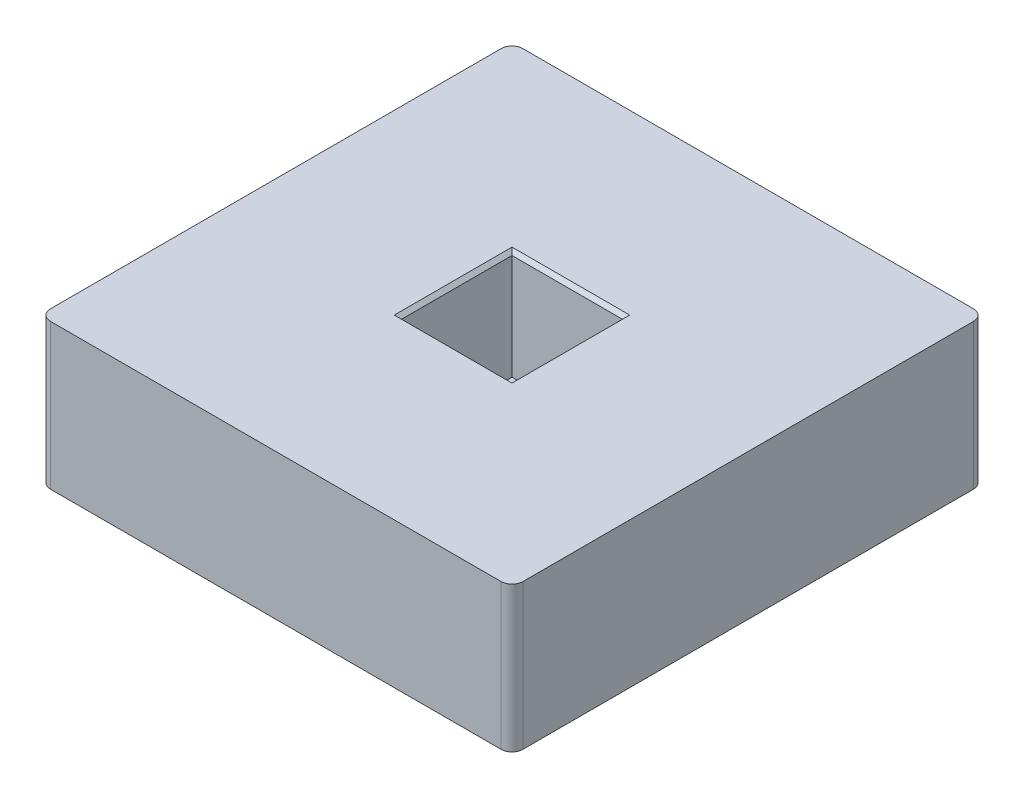
ISO-10303-21;
HEADER;
FILE_DESCRIPTION(('STEP AP214'),'2;1');
FILE_NAME('part.step','',(''),(''),'','','');
FILE_SCHEMA(('AUTOMOTIVE_DESIGN { 1 0 10303 214 1 1 1 1 }'));
ENDSEC;
DATA;
#1=APPLICATION_CONTEXT('core data for automotive mechanical design processes');
#2=APPLICATION_PROTOCOL_DEFINITION('international standard','automotive_design',2000,#1);
#3=PRODUCT_CONTEXT('',#1,'mechanical');
#4=PRODUCT('Part','Part','',(#3));
#5=PRODUCT_RELATED_PRODUCT_CATEGORY('part','',(#4));
#6=PRODUCT_DEFINITION_FORMATION('','',#4);
#7=PRODUCT_DEFINITION_CONTEXT('part definition',#1,'design');
#8=PRODUCT_DEFINITION('design','',#6,#7);
#9=PRODUCT_DEFINITION_SHAPE('','',#8);
#10=(LENGTH_UNIT() NAMED_UNIT(*) SI_UNIT(.MILLI.,.METRE.));
#11=(NAMED_UNIT(*) PLANE_ANGLE_UNIT() SI_UNIT($,.RADIAN.));
#12=(NAMED_UNIT(*) SI_UNIT($,.STERADIAN.) SOLID_ANGLE_UNIT());
#13=UNCERTAINTY_MEASURE_WITH_UNIT(LENGTH_MEASURE(1.E-05),#10,'distance_accuracy_value','');
#14=(GEOMETRIC_REPRESENTATION_CONTEXT(3) GLOBAL_UNCERTAINTY_ASSIGNED_CONTEXT((#13)) GLOBAL_UNIT_ASSIGNED_CONTEXT((#10,
#11,#12)) REPRESENTATION_CONTEXT('',''));
#15=CARTESIAN_POINT('',(0.,0.,0.));
#16=DIRECTION('',(0.,0.,1.));
#17=DIRECTION('',(1.,0.,0.));
#18=AXIS2_PLACEMENT_3D('',#15,#16,#17);
#19=CARTESIAN_POINT('',(65.,40.,-65.));
#20=DIRECTION('',(-1.,0.,0.));
#21=DIRECTION('',(0.,0.,1.));
#22=AXIS2_PLACEMENT_3D('',#19,#20,#21);
#23=PLANE('',#22);
#24=DIRECTION('',(0.,0.,-1.));
#25=VECTOR('',#24,1.);
#26=CARTESIAN_POINT('',(65.,0.,-65.));
#27=LINE('',#26,#25);
#28=CARTESIAN_POINT('',(65.,0.,62.));
#29=VERTEX_POINT('',#28);
#30=CARTESIAN_POINT('',(65.,0.,-62.));
#31=VERTEX_POINT('',#30);
#32=EDGE_CURVE('E177',#29,#31,#27,.T.);
#33=ORIENTED_EDGE('',*,*,#32,.T.);
#34=DIRECTION('',(0.,-1.,0.));
#35=VECTOR('',#34,1.);
#36=CARTESIAN_POINT('',(65.,40.,-62.));
#37=LINE('',#36,#35);
#38=CARTESIAN_POINT('',(65.,40.,-62.));
#39=VERTEX_POINT('',#38);
#40=EDGE_CURVE('E220',#31,#39,#37,.F.);
#41=ORIENTED_EDGE('',*,*,#40,.T.);
#42=DIRECTION('',(0.,0.,-1.));
#43=VECTOR('',#42,1.);
#44=CARTESIAN_POINT('',(65.,40.,-65.));
#45=LINE('',#44,#43);
#46=CARTESIAN_POINT('',(65.,40.,62.));
#47=VERTEX_POINT('',#46);
#48=EDGE_CURVE('E181',#47,#39,#45,.T.);
#49=ORIENTED_EDGE('',*,*,#48,.F.);
#50=DIRECTION('',(0.,-1.,0.));
#51=VECTOR('',#50,1.);
#52=CARTESIAN_POINT('',(65.,40.,62.));
#53=LINE('',#52,#51);
#54=EDGE_CURVE('E217',#47,#29,#53,.T.);
#55=ORIENTED_EDGE('',*,*,#54,.T.);
#56=EDGE_LOOP('',(#33,#41,#49,#55));
#57=FACE_BOUND('',#56,.T.);
#58=ADVANCED_FACE('F43',(#57),#23,.F.);
#59=CARTESIAN_POINT('',(-65.,40.,-65.));
#60=DIRECTION('',(0.,0.,1.));
#61=DIRECTION('',(1.,0.,0.));
#62=AXIS2_PLACEMENT_3D('',#59,#60,#61);
#63=PLANE('',#62);
#64=DIRECTION('',(-1.,0.,0.));
#65=VECTOR('',#64,1.);
#66=CARTESIAN_POINT('',(-65.,40.,-65.));
#67=LINE('',#66,#65);
#68=CARTESIAN_POINT('',(62.,40.,-65.));
#69=VERTEX_POINT('',#68);
#70=CARTESIAN_POINT('',(-62.,40.,-65.));
#71=VERTEX_POINT('',#70);
#72=EDGE_CURVE('E184',#69,#71,#67,.T.);
#73=ORIENTED_EDGE('',*,*,#72,.F.);
#74=DIRECTION('',(0.,-1.,0.));
#75=VECTOR('',#74,1.);
#76=CARTESIAN_POINT('',(62.,40.,-65.));
#77=LINE('',#76,#75);
#78=CARTESIAN_POINT('',(62.,0.,-65.));
#79=VERTEX_POINT('',#78);
#80=EDGE_CURVE('E206',#69,#79,#77,.T.);
#81=ORIENTED_EDGE('',*,*,#80,.T.);
#82=DIRECTION('',(-1.,0.,0.));
#83=VECTOR('',#82,1.);
#84=CARTESIAN_POINT('',(-65.,0.,-65.));
#85=LINE('',#84,#83);
#86=CARTESIAN_POINT('',(-62.,0.,-65.));
#87=VERTEX_POINT('',#86);
#88=EDGE_CURVE('E197',#79,#87,#85,.T.);
#89=ORIENTED_EDGE('',*,*,#88,.T.);
#90=DIRECTION('',(0.,-1.,0.));
#91=VECTOR('',#90,1.);
#92=CARTESIAN_POINT('',(-62.,40.,-65.));
#93=LINE('',#92,#91);
#94=EDGE_CURVE('E194',#87,#71,#93,.F.);
#95=ORIENTED_EDGE('',*,*,#94,.T.);
#96=EDGE_LOOP('',(#73,#81,#89,#95));
#97=FACE_BOUND('',#96,.T.);
#98=ADVANCED_FACE('F285',(#97),#63,.F.);
#99=CARTESIAN_POINT('',(-65.,40.,-65.));
#100=DIRECTION('',(1.,0.,0.));
#101=DIRECTION('',(0.,0.,-1.));
#102=AXIS2_PLACEMENT_3D('',#99,#100,#101);
#103=PLANE('',#102);
#104=DIRECTION('',(0.,0.,1.));
#105=VECTOR('',#104,1.);
#106=CARTESIAN_POINT('',(-65.,40.,-65.));
#107=LINE('',#106,#105);
#108=CARTESIAN_POINT('',(-65.,40.,-62.));
#109=VERTEX_POINT('',#108);
#110=CARTESIAN_POINT('',(-65.,40.,62.));
#111=VERTEX_POINT('',#110);
#112=EDGE_CURVE('E188',#109,#111,#107,.T.);
#113=ORIENTED_EDGE('',*,*,#112,.F.);
#114=DIRECTION('',(0.,-1.,0.));
#115=VECTOR('',#114,1.);
#116=CARTESIAN_POINT('',(-65.,40.,-62.));
#117=LINE('',#116,#115);
#118=CARTESIAN_POINT('',(-65.,0.,-62.));
#119=VERTEX_POINT('',#118);
#120=EDGE_CURVE('E232',#109,#119,#117,.T.);
#121=ORIENTED_EDGE('',*,*,#120,.T.);
#122=DIRECTION('',(0.,0.,1.));
#123=VECTOR('',#122,1.);
#124=CARTESIAN_POINT('',(-65.,0.,-65.));
#125=LINE('',#124,#123);
#126=CARTESIAN_POINT('',(-65.,0.,62.));
#127=VERTEX_POINT('',#126);
#128=EDGE_CURVE('E200',#119,#127,#125,.T.);
#129=ORIENTED_EDGE('',*,*,#128,.T.);
#130=DIRECTION('',(0.,-1.,0.));
#131=VECTOR('',#130,1.);
#132=CARTESIAN_POINT('',(-65.,40.,62.));
#133=LINE('',#132,#131);
#134=EDGE_CURVE('E230',#127,#111,#133,.F.);
#135=ORIENTED_EDGE('',*,*,#134,.T.);
#136=EDGE_LOOP('',(#113,#121,#129,#135));
#137=FACE_BOUND('',#136,.T.);
#138=ADVANCED_FACE('F291',(#137),#103,.F.);
#139=CARTESIAN_POINT('',(-65.,40.,65.));
#140=DIRECTION('',(0.,0.,-1.));
#141=DIRECTION('',(-1.,0.,0.));
#142=AXIS2_PLACEMENT_3D('',#139,#140,#141);
#143=PLANE('',#142);
#144=DIRECTION('',(1.,0.,0.));
#145=VECTOR('',#144,1.);
#146=CARTESIAN_POINT('',(-65.,40.,65.));
#147=LINE('',#146,#145);
#148=CARTESIAN_POINT('',(-62.,40.,65.));
#149=VERTEX_POINT('',#148);
#150=CARTESIAN_POINT('',(62.,40.,65.));
#151=VERTEX_POINT('',#150);
#152=EDGE_CURVE('E191',#149,#151,#147,.T.);
#153=ORIENTED_EDGE('',*,*,#152,.F.);
#154=DIRECTION('',(0.,-1.,0.));
#155=VECTOR('',#154,1.);
#156=CARTESIAN_POINT('',(-62.,40.,65.));
#157=LINE('',#156,#155);
#158=CARTESIAN_POINT('',(-62.,0.,65.));
#159=VERTEX_POINT('',#158);
#160=EDGE_CURVE('E237',#149,#159,#157,.T.);
#161=ORIENTED_EDGE('',*,*,#160,.T.);
#162=DIRECTION('',(1.,0.,0.));
#163=VECTOR('',#162,1.);
#164=CARTESIAN_POINT('',(-65.,0.,65.));
#165=LINE('',#164,#163);
#166=CARTESIAN_POINT('',(62.,0.,65.));
#167=VERTEX_POINT('',#166);
#168=EDGE_CURVE('E185',#159,#167,#165,.T.);
#169=ORIENTED_EDGE('',*,*,#168,.T.);
#170=DIRECTION('',(0.,-1.,0.));
#171=VECTOR('',#170,1.);
#172=CARTESIAN_POINT('',(62.,40.,65.));
#173=LINE('',#172,#171);
#174=EDGE_CURVE('E235',#167,#151,#173,.F.);
#175=ORIENTED_EDGE('',*,*,#174,.T.);
#176=EDGE_LOOP('',(#153,#161,#169,#175));
#177=FACE_BOUND('',#176,.T.);
#178=ADVANCED_FACE('F341',(#177),#143,.F.);
#179=CARTESIAN_POINT('',(0.,40.,0.));
#180=DIRECTION('',(0.,1.,0.));
#181=DIRECTION('',(0.,0.,1.));
#182=AXIS2_PLACEMENT_3D('',#179,#180,#181);
#183=PLANE('',#182);
#184=DIRECTION('',(0.,0.,-1.));
#185=VECTOR('',#184,1.);
#186=CARTESIAN_POINT('',(-16.2,40.,-15.2));
#187=LINE('',#186,#185);
#188=CARTESIAN_POINT('',(-16.2,40.,16.2));
#189=VERTEX_POINT('',#188);
#190=CARTESIAN_POINT('',(-16.2,40.,-16.2));
#191=VERTEX_POINT('',#190);
#192=EDGE_CURVE('E246',#189,#191,#187,.T.);
#193=ORIENTED_EDGE('',*,*,#192,.T.);
#194=DIRECTION('',(1.,0.,0.));
#195=VECTOR('',#194,1.);
#196=CARTESIAN_POINT('',(15.2,40.,-16.2));
#197=LINE('',#196,#195);
#198=CARTESIAN_POINT('',(16.2,40.,-16.2));
#199=VERTEX_POINT('',#198);
#200=EDGE_CURVE('E248',#191,#199,#197,.T.);
#201=ORIENTED_EDGE('',*,*,#200,.T.);
#202=DIRECTION('',(0.,0.,1.));
#203=VECTOR('',#202,1.);
#204=CARTESIAN_POINT('',(16.2,40.,15.2));
#205=LINE('',#204,#203);
#206=CARTESIAN_POINT('',(16.2,40.,16.2));
#207=VERTEX_POINT('',#206);
#208=EDGE_CURVE('E242',#199,#207,#205,.T.);
#209=ORIENTED_EDGE('',*,*,#208,.T.);
#210=DIRECTION('',(-1.,0.,0.));
#211=VECTOR('',#210,1.);
#212=CARTESIAN_POINT('',(-15.2,40.,16.2));
#213=LINE('',#212,#211);
#214=EDGE_CURVE('E244',#207,#189,#213,.T.);
#215=ORIENTED_EDGE('',*,*,#214,.T.);
#216=EDGE_LOOP('',(#193,#201,#209,#215));
#217=FACE_BOUND('',#216,.T.);
#218=ORIENTED_EDGE('',*,*,#48,.T.);
#219=CARTESIAN_POINT('',(62.,40.,-62.));
#220=DIRECTION('',(0.,1.,0.));
#221=DIRECTION('',(0.,0.,1.));
#222=AXIS2_PLACEMENT_3D('',#219,#220,#221);
#223=CIRCLE('',#222,3.);
#224=EDGE_CURVE('E228',#39,#69,#223,.T.);
#225=ORIENTED_EDGE('',*,*,#224,.T.);
#226=ORIENTED_EDGE('',*,*,#72,.T.);
#227=CARTESIAN_POINT('',(-62.,40.,-62.));
#228=DIRECTION('',(0.,1.,0.));
#229=DIRECTION('',(0.,0.,1.));
#230=AXIS2_PLACEMENT_3D('',#227,#228,#229);
#231=CIRCLE('',#230,3.);
#232=EDGE_CURVE('E226',#71,#109,#231,.T.);
#233=ORIENTED_EDGE('',*,*,#232,.T.);
#234=ORIENTED_EDGE('',*,*,#112,.T.);
#235=CARTESIAN_POINT('',(-62.,40.,62.));
#236=DIRECTION('',(0.,1.,0.));
#237=DIRECTION('',(0.,0.,1.));
#238=AXIS2_PLACEMENT_3D('',#235,#236,#237);
#239=CIRCLE('',#238,3.);
#240=EDGE_CURVE('E224',#111,#149,#239,.T.);
#241=ORIENTED_EDGE('',*,*,#240,.T.);
#242=ORIENTED_EDGE('',*,*,#152,.T.);
#243=CARTESIAN_POINT('',(62.,40.,62.));
#244=DIRECTION('',(0.,1.,0.));
#245=DIRECTION('',(0.,0.,1.));
#246=AXIS2_PLACEMENT_3D('',#243,#244,#245);
#247=CIRCLE('',#246,3.);
#248=EDGE_CURVE('E222',#151,#47,#247,.T.);
#249=ORIENTED_EDGE('',*,*,#248,.T.);
#250=EDGE_LOOP('',(#218,#225,#226,#233,#234,#241,#242,#249));
#251=FACE_BOUND('',#250,.T.);
#252=ADVANCED_FACE('F339',(#217,#251),#183,.T.);
#253=CARTESIAN_POINT('',(0.,0.,0.));
#254=DIRECTION('',(0.,1.,0.));
#255=DIRECTION('',(0.,0.,1.));
#256=AXIS2_PLACEMENT_3D('',#253,#254,#255);
#257=PLANE('',#256);
#258=ORIENTED_EDGE('',*,*,#88,.F.);
#259=CARTESIAN_POINT('',(62.,0.,-62.));
#260=DIRECTION('',(0.,1.,0.));
#261=DIRECTION('',(0.,0.,1.));
#262=AXIS2_PLACEMENT_3D('',#259,#260,#261);
#263=CIRCLE('',#262,3.);
#264=EDGE_CURVE('E215',#79,#31,#263,.F.);
#265=ORIENTED_EDGE('',*,*,#264,.T.);
#266=ORIENTED_EDGE('',*,*,#32,.F.);
#267=CARTESIAN_POINT('',(62.,0.,62.));
#268=DIRECTION('',(0.,1.,0.));
#269=DIRECTION('',(0.,0.,1.));
#270=AXIS2_PLACEMENT_3D('',#267,#268,#269);
#271=CIRCLE('',#270,3.);
#272=EDGE_CURVE('E209',#29,#167,#271,.F.);
#273=ORIENTED_EDGE('',*,*,#272,.T.);
#274=ORIENTED_EDGE('',*,*,#168,.F.);
#275=CARTESIAN_POINT('',(-62.,0.,62.));
#276=DIRECTION('',(0.,1.,0.));
#277=DIRECTION('',(0.,0.,1.));
#278=AXIS2_PLACEMENT_3D('',#275,#276,#277);
#279=CIRCLE('',#278,3.);
#280=EDGE_CURVE('E211',#159,#127,#279,.F.);
#281=ORIENTED_EDGE('',*,*,#280,.T.);
#282=ORIENTED_EDGE('',*,*,#128,.F.);
#283=CARTESIAN_POINT('',(-62.,0.,-62.));
#284=DIRECTION('',(0.,1.,0.));
#285=DIRECTION('',(0.,0.,1.));
#286=AXIS2_PLACEMENT_3D('',#283,#284,#285);
#287=CIRCLE('',#286,3.);
#288=EDGE_CURVE('E213',#119,#87,#287,.F.);
#289=ORIENTED_EDGE('',*,*,#288,.T.);
#290=EDGE_LOOP('',(#258,#265,#266,#273,#274,#281,#282,#289));
#291=FACE_BOUND('',#290,.T.);
#292=ADVANCED_FACE('F300',(#291),#257,.F.);
#293=CARTESIAN_POINT('',(62.,40.,-62.));
#294=DIRECTION('',(0.,-1.,0.));
#295=DIRECTION('',(0.,0.,-1.));
#296=AXIS2_PLACEMENT_3D('',#293,#294,#295);
#297=CYLINDRICAL_SURFACE('',#296,3.);
#298=ORIENTED_EDGE('',*,*,#224,.F.);
#299=ORIENTED_EDGE('',*,*,#40,.F.);
#300=ORIENTED_EDGE('',*,*,#264,.F.);
#301=ORIENTED_EDGE('',*,*,#80,.F.);
#302=EDGE_LOOP('',(#298,#299,#300,#301));
#303=FACE_BOUND('',#302,.T.);
#304=ADVANCED_FACE('F296',(#303),#297,.T.);
#305=CARTESIAN_POINT('',(-62.,40.,-62.));
#306=DIRECTION('',(0.,-1.,0.));
#307=DIRECTION('',(0.,0.,-1.));
#308=AXIS2_PLACEMENT_3D('',#305,#306,#307);
#309=CYLINDRICAL_SURFACE('',#308,3.);
#310=ORIENTED_EDGE('',*,*,#232,.F.);
#311=ORIENTED_EDGE('',*,*,#94,.F.);
#312=ORIENTED_EDGE('',*,*,#288,.F.);
#313=ORIENTED_EDGE('',*,*,#120,.F.);
#314=EDGE_LOOP('',(#310,#311,#312,#313));
#315=FACE_BOUND('',#314,.T.);
#316=ADVANCED_FACE('F299',(#315),#309,.T.);
#317=CARTESIAN_POINT('',(-62.,40.,62.));
#318=DIRECTION('',(0.,-1.,0.));
#319=DIRECTION('',(0.,0.,-1.));
#320=AXIS2_PLACEMENT_3D('',#317,#318,#319);
#321=CYLINDRICAL_SURFACE('',#320,3.);
#322=ORIENTED_EDGE('',*,*,#240,.F.);
#323=ORIENTED_EDGE('',*,*,#134,.F.);
#324=ORIENTED_EDGE('',*,*,#280,.F.);
#325=ORIENTED_EDGE('',*,*,#160,.F.);
#326=EDGE_LOOP('',(#322,#323,#324,#325));
#327=FACE_BOUND('',#326,.T.);
#328=ADVANCED_FACE('F304',(#327),#321,.T.);
#329=CARTESIAN_POINT('',(62.,40.,62.));
#330=DIRECTION('',(0.,-1.,0.));
#331=DIRECTION('',(0.,0.,-1.));
#332=AXIS2_PLACEMENT_3D('',#329,#330,#331);
#333=CYLINDRICAL_SURFACE('',#332,3.);
#334=ORIENTED_EDGE('',*,*,#248,.F.);
#335=ORIENTED_EDGE('',*,*,#174,.F.);
#336=ORIENTED_EDGE('',*,*,#272,.F.);
#337=ORIENTED_EDGE('',*,*,#54,.F.);
#338=EDGE_LOOP('',(#334,#335,#336,#337));
#339=FACE_BOUND('',#338,.T.);
#340=ADVANCED_FACE('F281',(#339),#333,.T.);
#341=CARTESIAN_POINT('',(15.2,10.,-15.2));
#342=DIRECTION('',(1.,0.,0.));
#343=DIRECTION('',(0.,0.,-1.));
#344=AXIS2_PLACEMENT_3D('',#341,#342,#343);
#345=PLANE('',#344);
#346=DIRECTION('',(0.,1.,0.));
#347=VECTOR('',#346,1.);
#348=CARTESIAN_POINT('',(15.2,10.,15.2));
#349=LINE('',#348,#347);
#350=CARTESIAN_POINT('',(15.2,10.,15.2));
#351=VERTEX_POINT('',#350);
#352=CARTESIAN_POINT('',(15.2,39.,15.2));
#353=VERTEX_POINT('',#352);
#354=EDGE_CURVE('E175',#351,#353,#349,.T.);
#355=ORIENTED_EDGE('',*,*,#354,.T.);
#356=DIRECTION('',(0.,0.,-1.));
#357=VECTOR('',#356,1.);
#358=CARTESIAN_POINT('',(15.2,39.,-15.2));
#359=LINE('',#358,#357);
#360=CARTESIAN_POINT('',(15.2,39.,-15.2));
#361=VERTEX_POINT('',#360);
#362=EDGE_CURVE('E11',#353,#361,#359,.T.);
#363=ORIENTED_EDGE('',*,*,#362,.T.);
#364=DIRECTION('',(0.,1.,0.));
#365=VECTOR('',#364,1.);
#366=CARTESIAN_POINT('',(15.2,10.,-15.2));
#367=LINE('',#366,#365);
#368=CARTESIAN_POINT('',(15.2,10.,-15.2));
#369=VERTEX_POINT('',#368);
#370=EDGE_CURVE('E146',#369,#361,#367,.T.);
#371=ORIENTED_EDGE('',*,*,#370,.F.);
#372=DIRECTION('',(0.,0.,-1.));
#373=VECTOR('',#372,1.);
#374=CARTESIAN_POINT('',(15.2,10.,-15.2));
#375=LINE('',#374,#373);
#376=EDGE_CURVE('E150',#351,#369,#375,.T.);
#377=ORIENTED_EDGE('',*,*,#376,.F.);
#378=EDGE_LOOP('',(#355,#363,#371,#377));
#379=FACE_BOUND('',#378,.T.);
#380=ADVANCED_FACE('F148',(#379),#345,.F.);
#381=CARTESIAN_POINT('',(-15.2,10.,15.2));
#382=DIRECTION('',(0.,0.,1.));
#383=DIRECTION('',(1.,0.,0.));
#384=AXIS2_PLACEMENT_3D('',#381,#382,#383);
#385=PLANE('',#384);
#386=DIRECTION('',(0.,1.,0.));
#387=VECTOR('',#386,1.);
#388=CARTESIAN_POINT('',(-15.2,10.,15.2));
#389=LINE('',#388,#387);
#390=CARTESIAN_POINT('',(-15.2,10.,15.2));
#391=VERTEX_POINT('',#390);
#392=CARTESIAN_POINT('',(-15.2,39.,15.2));
#393=VERTEX_POINT('',#392);
#394=EDGE_CURVE('E178',#391,#393,#389,.T.);
#395=ORIENTED_EDGE('',*,*,#394,.T.);
#396=DIRECTION('',(1.,0.,0.));
#397=VECTOR('',#396,1.);
#398=CARTESIAN_POINT('',(15.2,39.,15.2));
#399=LINE('',#398,#397);
#400=EDGE_CURVE('E53',#393,#353,#399,.T.);
#401=ORIENTED_EDGE('',*,*,#400,.T.);
#402=ORIENTED_EDGE('',*,*,#354,.F.);
#403=DIRECTION('',(1.,0.,0.));
#404=VECTOR('',#403,1.);
#405=CARTESIAN_POINT('',(-15.2,10.,15.2));
#406=LINE('',#405,#404);
#407=EDGE_CURVE('E157',#391,#351,#406,.T.);
#408=ORIENTED_EDGE('',*,*,#407,.F.);
#409=EDGE_LOOP('',(#395,#401,#402,#408));
#410=FACE_BOUND('',#409,.T.);
#411=ADVANCED_FACE('F273',(#410),#385,.F.);
#412=CARTESIAN_POINT('',(-15.2,10.,-15.2));
#413=DIRECTION('',(-1.,0.,0.));
#414=DIRECTION('',(0.,0.,1.));
#415=AXIS2_PLACEMENT_3D('',#412,#413,#414);
#416=PLANE('',#415);
#417=DIRECTION('',(0.,1.,0.));
#418=VECTOR('',#417,1.);
#419=CARTESIAN_POINT('',(-15.2,10.,-15.2));
#420=LINE('',#419,#418);
#421=CARTESIAN_POINT('',(-15.2,10.,-15.2));
#422=VERTEX_POINT('',#421);
#423=CARTESIAN_POINT('',(-15.2,39.,-15.2));
#424=VERTEX_POINT('',#423);
#425=EDGE_CURVE('E156',#422,#424,#420,.T.);
#426=ORIENTED_EDGE('',*,*,#425,.T.);
#427=DIRECTION('',(0.,0.,1.));
#428=VECTOR('',#427,1.);
#429=CARTESIAN_POINT('',(-15.2,39.,15.2));
#430=LINE('',#429,#428);
#431=EDGE_CURVE('E68',#424,#393,#430,.T.);
#432=ORIENTED_EDGE('',*,*,#431,.T.);
#433=ORIENTED_EDGE('',*,*,#394,.F.);
#434=DIRECTION('',(0.,0.,1.));
#435=VECTOR('',#434,1.);
#436=CARTESIAN_POINT('',(-15.2,10.,-15.2));
#437=LINE('',#436,#435);
#438=EDGE_CURVE('E165',#422,#391,#437,.T.);
#439=ORIENTED_EDGE('',*,*,#438,.F.);
#440=EDGE_LOOP('',(#426,#432,#433,#439));
#441=FACE_BOUND('',#440,.T.);
#442=ADVANCED_FACE('F272',(#441),#416,.F.);
#443=CARTESIAN_POINT('',(-15.2,10.,-15.2));
#444=DIRECTION('',(0.,0.,-1.));
#445=DIRECTION('',(-1.,0.,0.));
#446=AXIS2_PLACEMENT_3D('',#443,#444,#445);
#447=PLANE('',#446);
#448=ORIENTED_EDGE('',*,*,#370,.T.);
#449=DIRECTION('',(-1.,0.,0.));
#450=VECTOR('',#449,1.);
#451=CARTESIAN_POINT('',(-15.2,39.,-15.2));
#452=LINE('',#451,#450);
#453=EDGE_CURVE('E240',#361,#424,#452,.T.);
#454=ORIENTED_EDGE('',*,*,#453,.T.);
#455=ORIENTED_EDGE('',*,*,#425,.F.);
#456=DIRECTION('',(-1.,0.,0.));
#457=VECTOR('',#456,1.);
#458=CARTESIAN_POINT('',(-15.2,10.,-15.2));
#459=LINE('',#458,#457);
#460=EDGE_CURVE('E160',#369,#422,#459,.T.);
#461=ORIENTED_EDGE('',*,*,#460,.F.);
#462=EDGE_LOOP('',(#448,#454,#455,#461));
#463=FACE_BOUND('',#462,.T.);
#464=ADVANCED_FACE('F161',(#463),#447,.F.);
#465=CARTESIAN_POINT('',(0.,10.,0.));
#466=DIRECTION('',(0.,1.,0.));
#467=DIRECTION('',(0.,0.,1.));
#468=AXIS2_PLACEMENT_3D('',#465,#466,#467);
#469=PLANE('',#468);
#470=ORIENTED_EDGE('',*,*,#376,.T.);
#471=ORIENTED_EDGE('',*,*,#460,.T.);
#472=ORIENTED_EDGE('',*,*,#438,.T.);
#473=ORIENTED_EDGE('',*,*,#407,.T.);
#474=EDGE_LOOP('',(#470,#471,#472,#473));
#475=FACE_BOUND('',#474,.T.);
#476=ADVANCED_FACE('F167',(#475),#469,.T.);
#477=CARTESIAN_POINT('',(-15.2,39.,15.2));
#478=DIRECTION('',(0.,0.707106781186547,-0.707106781186547));
#479=DIRECTION('',(-1.,0.,0.));
#480=AXIS2_PLACEMENT_3D('',#477,#478,#479);
#481=PLANE('',#480);
#482=DIRECTION('',(-0.577350269189624,0.577350269189627,0.577350269189627));
#483=VECTOR('',#482,1.);
#484=CARTESIAN_POINT('',(-5.06666666666668,28.8666666666666,5.06666666666662));
#485=LINE('',#484,#483);
#486=EDGE_CURVE('E171',#189,#393,#485,.F.);
#487=ORIENTED_EDGE('',*,*,#486,.F.);
#488=ORIENTED_EDGE('',*,*,#214,.F.);
#489=DIRECTION('',(0.577350269189626,0.577350269189626,0.577350269189626));
#490=VECTOR('',#489,1.);
#491=CARTESIAN_POINT('',(5.06666666666666,28.8666666666667,5.06666666666665));
#492=LINE('',#491,#490);
#493=EDGE_CURVE('E48',#353,#207,#492,.T.);
#494=ORIENTED_EDGE('',*,*,#493,.F.);
#495=ORIENTED_EDGE('',*,*,#400,.F.);
#496=EDGE_LOOP('',(#487,#488,#494,#495));
#497=FACE_BOUND('',#496,.T.);
#498=ADVANCED_FACE('F46',(#497),#481,.T.);
#499=CARTESIAN_POINT('',(15.2,39.,-15.2));
#500=DIRECTION('',(-0.707106781186547,0.707106781186548,0.));
#501=DIRECTION('',(0.,0.,1.));
#502=AXIS2_PLACEMENT_3D('',#499,#500,#501);
#503=PLANE('',#502);
#504=ORIENTED_EDGE('',*,*,#493,.T.);
#505=ORIENTED_EDGE('',*,*,#208,.F.);
#506=DIRECTION('',(-0.577350269189626,-0.577350269189626,0.577350269189626));
#507=VECTOR('',#506,1.);
#508=CARTESIAN_POINT('',(5.06666666666665,28.8666666666667,-5.06666666666667));
#509=LINE('',#508,#507);
#510=EDGE_CURVE('E255',#361,#199,#509,.F.);
#511=ORIENTED_EDGE('',*,*,#510,.F.);
#512=ORIENTED_EDGE('',*,*,#362,.F.);
#513=EDGE_LOOP('',(#504,#505,#511,#512));
#514=FACE_BOUND('',#513,.T.);
#515=ADVANCED_FACE('F267',(#514),#503,.T.);
#516=CARTESIAN_POINT('',(-15.2,39.,-15.2));
#517=DIRECTION('',(0.707106781186549,0.707106781186546,0.));
#518=DIRECTION('',(0.,0.,-1.));
#519=AXIS2_PLACEMENT_3D('',#516,#517,#518);
#520=PLANE('',#519);
#521=ORIENTED_EDGE('',*,*,#486,.T.);
#522=ORIENTED_EDGE('',*,*,#431,.F.);
#523=DIRECTION('',(-0.577350269189624,0.577350269189627,-0.577350269189627));
#524=VECTOR('',#523,1.);
#525=CARTESIAN_POINT('',(-15.2,39.,-15.2));
#526=LINE('',#525,#524);
#527=EDGE_CURVE('E253',#191,#424,#526,.F.);
#528=ORIENTED_EDGE('',*,*,#527,.F.);
#529=ORIENTED_EDGE('',*,*,#192,.F.);
#530=EDGE_LOOP('',(#521,#522,#528,#529));
#531=FACE_BOUND('',#530,.T.);
#532=ADVANCED_FACE('F260',(#531),#520,.T.);
#533=CARTESIAN_POINT('',(-15.2,39.,-15.2));
#534=DIRECTION('',(0.,0.707106781186547,0.707106781186547));
#535=DIRECTION('',(1.,0.,0.));
#536=AXIS2_PLACEMENT_3D('',#533,#534,#535);
#537=PLANE('',#536);
#538=ORIENTED_EDGE('',*,*,#510,.T.);
#539=ORIENTED_EDGE('',*,*,#200,.F.);
#540=ORIENTED_EDGE('',*,*,#527,.T.);
#541=ORIENTED_EDGE('',*,*,#453,.F.);
#542=EDGE_LOOP('',(#538,#539,#540,#541));
#543=FACE_BOUND('',#542,.T.);
#544=ADVANCED_FACE('F271',(#543),#537,.T.);
#545=CLOSED_SHELL('',(#58,#98,#138,#178,#252,#292,#304,#316,#328,#340,#380,#411,#442,#464,#476,
#498,#515,#532,#544));
#546=MANIFOLD_SOLID_BREP('B2',#545);
#547=ADVANCED_BREP_SHAPE_REPRESENTATION('',(#18,#546),#14);
#548=SHAPE_DEFINITION_REPRESENTATION(#9,#547);
ENDSEC;
END-ISO-10303-21;
